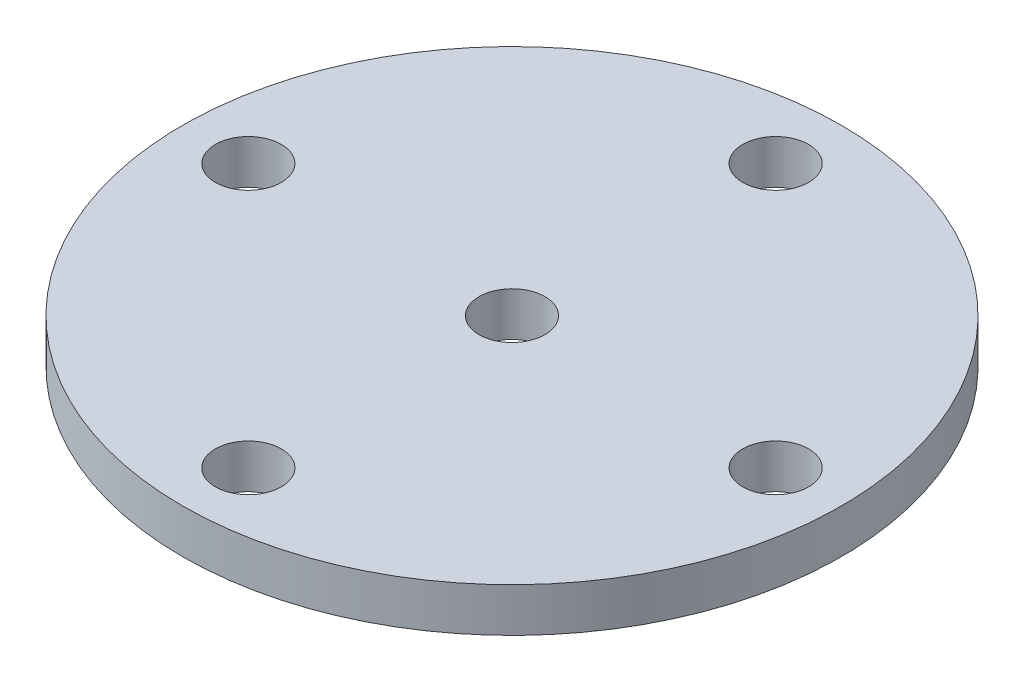
ISO-10303-21;
HEADER;
FILE_DESCRIPTION(('STEP AP214'),'2;1');
FILE_NAME('part.step','',(''),(''),'','','');
FILE_SCHEMA(('AUTOMOTIVE_DESIGN { 1 0 10303 214 1 1 1 1 }'));
ENDSEC;
DATA;
#1=APPLICATION_CONTEXT('core data for automotive mechanical design processes');
#2=APPLICATION_PROTOCOL_DEFINITION('international standard','automotive_design',2000,#1);
#3=PRODUCT_CONTEXT('',#1,'mechanical');
#4=PRODUCT('Part','Part','',(#3));
#5=PRODUCT_RELATED_PRODUCT_CATEGORY('part','',(#4));
#6=PRODUCT_DEFINITION_FORMATION('','',#4);
#7=PRODUCT_DEFINITION_CONTEXT('part definition',#1,'design');
#8=PRODUCT_DEFINITION('design','',#6,#7);
#9=PRODUCT_DEFINITION_SHAPE('','',#8);
#10=(LENGTH_UNIT() NAMED_UNIT(*) SI_UNIT(.MILLI.,.METRE.));
#11=(NAMED_UNIT(*) PLANE_ANGLE_UNIT() SI_UNIT($,.RADIAN.));
#12=(NAMED_UNIT(*) SI_UNIT($,.STERADIAN.) SOLID_ANGLE_UNIT());
#13=UNCERTAINTY_MEASURE_WITH_UNIT(LENGTH_MEASURE(1.E-05),#10,'distance_accuracy_value','');
#14=(GEOMETRIC_REPRESENTATION_CONTEXT(3) GLOBAL_UNCERTAINTY_ASSIGNED_CONTEXT((#13)) GLOBAL_UNIT_ASSIGNED_CONTEXT((#10,
#11,#12)) REPRESENTATION_CONTEXT('',''));
#15=CARTESIAN_POINT('',(0.,0.,0.));
#16=DIRECTION('',(0.,0.,1.));
#17=DIRECTION('',(1.,0.,0.));
#18=AXIS2_PLACEMENT_3D('',#15,#16,#17);
#19=CARTESIAN_POINT('',(0.,2.,0.));
#20=DIRECTION('',(0.,1.,0.));
#21=DIRECTION('',(0.,0.,1.));
#22=AXIS2_PLACEMENT_3D('',#19,#20,#21);
#23=PLANE('',#22);
#24=CARTESIAN_POINT('',(0.,2.,-12.));
#25=DIRECTION('',(0.,1.,0.));
#26=DIRECTION('',(0.,0.,1.));
#27=AXIS2_PLACEMENT_3D('',#24,#25,#26);
#28=CIRCLE('',#27,1.5);
#29=CARTESIAN_POINT('',(0.,2.,-10.5));
#30=VERTEX_POINT('',#29);
#31=EDGE_CURVE('E72',#30,#30,#28,.T.);
#32=ORIENTED_EDGE('',*,*,#31,.F.);
#33=EDGE_LOOP('',(#32));
#34=FACE_BOUND('',#33,.T.);
#35=CARTESIAN_POINT('',(-12.,2.,0.));
#36=DIRECTION('',(0.,1.,0.));
#37=DIRECTION('',(0.,0.,1.));
#38=AXIS2_PLACEMENT_3D('',#35,#36,#37);
#39=CIRCLE('',#38,1.5);
#40=CARTESIAN_POINT('',(-12.,2.,1.5));
#41=VERTEX_POINT('',#40);
#42=EDGE_CURVE('E56',#41,#41,#39,.T.);
#43=ORIENTED_EDGE('',*,*,#42,.F.);
#44=EDGE_LOOP('',(#43));
#45=FACE_BOUND('',#44,.T.);
#46=CARTESIAN_POINT('',(0.,2.,0.));
#47=DIRECTION('',(0.,1.,0.));
#48=DIRECTION('',(0.,0.,1.));
#49=AXIS2_PLACEMENT_3D('',#46,#47,#48);
#50=CIRCLE('',#49,15.);
#51=CARTESIAN_POINT('',(0.,2.,15.));
#52=VERTEX_POINT('',#51);
#53=EDGE_CURVE('E10',#52,#52,#50,.T.);
#54=ORIENTED_EDGE('',*,*,#53,.T.);
#55=EDGE_LOOP('',(#54));
#56=FACE_BOUND('',#55,.T.);
#57=CARTESIAN_POINT('',(0.,2.,0.));
#58=DIRECTION('',(0.,1.,0.));
#59=DIRECTION('',(0.,0.,1.));
#60=AXIS2_PLACEMENT_3D('',#57,#58,#59);
#61=CIRCLE('',#60,1.5);
#62=CARTESIAN_POINT('',(0.,2.,1.5));
#63=VERTEX_POINT('',#62);
#64=EDGE_CURVE('E50',#63,#63,#61,.T.);
#65=ORIENTED_EDGE('',*,*,#64,.F.);
#66=EDGE_LOOP('',(#65));
#67=FACE_BOUND('',#66,.T.);
#68=CARTESIAN_POINT('',(12.,2.,0.));
#69=DIRECTION('',(0.,1.,0.));
#70=DIRECTION('',(0.,0.,-1.));
#71=AXIS2_PLACEMENT_3D('',#68,#69,#70);
#72=CIRCLE('',#71,1.5);
#73=CARTESIAN_POINT('',(12.,2.,-1.5));
#74=VERTEX_POINT('',#73);
#75=EDGE_CURVE('E64',#74,#74,#72,.T.);
#76=ORIENTED_EDGE('',*,*,#75,.F.);
#77=EDGE_LOOP('',(#76));
#78=FACE_BOUND('',#77,.T.);
#79=CARTESIAN_POINT('',(0.,2.,12.));
#80=DIRECTION('',(0.,1.,0.));
#81=DIRECTION('',(0.,0.,-1.));
#82=AXIS2_PLACEMENT_3D('',#79,#80,#81);
#83=CIRCLE('',#82,1.5);
#84=CARTESIAN_POINT('',(0.,2.,10.5));
#85=VERTEX_POINT('',#84);
#86=EDGE_CURVE('E80',#85,#85,#83,.T.);
#87=ORIENTED_EDGE('',*,*,#86,.F.);
#88=EDGE_LOOP('',(#87));
#89=FACE_BOUND('',#88,.T.);
#90=ADVANCED_FACE('F37',(#34,#45,#56,#67,#78,#89),#23,.T.);
#91=CARTESIAN_POINT('',(0.,0.,0.));
#92=DIRECTION('',(0.,1.,0.));
#93=DIRECTION('',(0.,0.,1.));
#94=AXIS2_PLACEMENT_3D('',#91,#92,#93);
#95=PLANE('',#94);
#96=CARTESIAN_POINT('',(0.,0.,0.));
#97=DIRECTION('',(0.,1.,0.));
#98=DIRECTION('',(0.,0.,1.));
#99=AXIS2_PLACEMENT_3D('',#96,#97,#98);
#100=CIRCLE('',#99,15.);
#101=CARTESIAN_POINT('',(0.,0.,15.));
#102=VERTEX_POINT('',#101);
#103=EDGE_CURVE('E41',#102,#102,#100,.T.);
#104=ORIENTED_EDGE('',*,*,#103,.F.);
#105=EDGE_LOOP('',(#104));
#106=FACE_BOUND('',#105,.T.);
#107=CARTESIAN_POINT('',(0.,0.,0.));
#108=DIRECTION('',(0.,1.,0.));
#109=DIRECTION('',(0.,0.,1.));
#110=AXIS2_PLACEMENT_3D('',#107,#108,#109);
#111=CIRCLE('',#110,1.5);
#112=CARTESIAN_POINT('',(0.,0.,1.5));
#113=VERTEX_POINT('',#112);
#114=EDGE_CURVE('E52',#113,#113,#111,.T.);
#115=ORIENTED_EDGE('',*,*,#114,.T.);
#116=EDGE_LOOP('',(#115));
#117=FACE_BOUND('',#116,.T.);
#118=CARTESIAN_POINT('',(-12.,0.,0.));
#119=DIRECTION('',(0.,1.,0.));
#120=DIRECTION('',(0.,0.,1.));
#121=AXIS2_PLACEMENT_3D('',#118,#119,#120);
#122=CIRCLE('',#121,1.5);
#123=CARTESIAN_POINT('',(-12.,0.,1.5));
#124=VERTEX_POINT('',#123);
#125=EDGE_CURVE('E60',#124,#124,#122,.T.);
#126=ORIENTED_EDGE('',*,*,#125,.T.);
#127=EDGE_LOOP('',(#126));
#128=FACE_BOUND('',#127,.T.);
#129=CARTESIAN_POINT('',(12.,0.,0.));
#130=DIRECTION('',(0.,1.,0.));
#131=DIRECTION('',(0.,0.,-1.));
#132=AXIS2_PLACEMENT_3D('',#129,#130,#131);
#133=CIRCLE('',#132,1.5);
#134=CARTESIAN_POINT('',(12.,0.,-1.5));
#135=VERTEX_POINT('',#134);
#136=EDGE_CURVE('E68',#135,#135,#133,.T.);
#137=ORIENTED_EDGE('',*,*,#136,.T.);
#138=EDGE_LOOP('',(#137));
#139=FACE_BOUND('',#138,.T.);
#140=CARTESIAN_POINT('',(0.,0.,-12.));
#141=DIRECTION('',(0.,1.,0.));
#142=DIRECTION('',(0.,0.,1.));
#143=AXIS2_PLACEMENT_3D('',#140,#141,#142);
#144=CIRCLE('',#143,1.5);
#145=CARTESIAN_POINT('',(0.,0.,-10.5));
#146=VERTEX_POINT('',#145);
#147=EDGE_CURVE('E76',#146,#146,#144,.T.);
#148=ORIENTED_EDGE('',*,*,#147,.T.);
#149=EDGE_LOOP('',(#148));
#150=FACE_BOUND('',#149,.T.);
#151=CARTESIAN_POINT('',(0.,0.,12.));
#152=DIRECTION('',(0.,1.,0.));
#153=DIRECTION('',(0.,0.,-1.));
#154=AXIS2_PLACEMENT_3D('',#151,#152,#153);
#155=CIRCLE('',#154,1.5);
#156=CARTESIAN_POINT('',(0.,0.,10.5));
#157=VERTEX_POINT('',#156);
#158=EDGE_CURVE('E84',#157,#157,#155,.T.);
#159=ORIENTED_EDGE('',*,*,#158,.T.);
#160=EDGE_LOOP('',(#159));
#161=FACE_BOUND('',#160,.T.);
#162=ADVANCED_FACE('F96',(#106,#117,#128,#139,#150,#161),#95,.F.);
#163=CARTESIAN_POINT('',(0.,2.,0.));
#164=DIRECTION('',(0.,-1.,0.));
#165=DIRECTION('',(0.,0.,-1.));
#166=AXIS2_PLACEMENT_3D('',#163,#164,#165);
#167=CYLINDRICAL_SURFACE('',#166,15.);
#168=ORIENTED_EDGE('',*,*,#53,.F.);
#169=EDGE_LOOP('',(#168));
#170=FACE_BOUND('',#169,.T.);
#171=ORIENTED_EDGE('',*,*,#103,.T.);
#172=EDGE_LOOP('',(#171));
#173=FACE_BOUND('',#172,.T.);
#174=ADVANCED_FACE('F39',(#170,#173),#167,.T.);
#175=CARTESIAN_POINT('',(0.,2.,0.));
#176=DIRECTION('',(0.,-1.,0.));
#177=DIRECTION('',(0.,0.,-1.));
#178=AXIS2_PLACEMENT_3D('',#175,#176,#177);
#179=CYLINDRICAL_SURFACE('',#178,1.5);
#180=ORIENTED_EDGE('',*,*,#64,.T.);
#181=EDGE_LOOP('',(#180));
#182=FACE_BOUND('',#181,.T.);
#183=ORIENTED_EDGE('',*,*,#114,.F.);
#184=EDGE_LOOP('',(#183));
#185=FACE_BOUND('',#184,.T.);
#186=ADVANCED_FACE('F106',(#182,#185),#179,.F.);
#187=CARTESIAN_POINT('',(-12.,2.,0.));
#188=DIRECTION('',(0.,-1.,0.));
#189=DIRECTION('',(0.,0.,-1.));
#190=AXIS2_PLACEMENT_3D('',#187,#188,#189);
#191=CYLINDRICAL_SURFACE('',#190,1.5);
#192=ORIENTED_EDGE('',*,*,#42,.T.);
#193=EDGE_LOOP('',(#192));
#194=FACE_BOUND('',#193,.T.);
#195=ORIENTED_EDGE('',*,*,#125,.F.);
#196=EDGE_LOOP('',(#195));
#197=FACE_BOUND('',#196,.T.);
#198=ADVANCED_FACE('F109',(#194,#197),#191,.F.);
#199=CARTESIAN_POINT('',(12.,2.,0.));
#200=DIRECTION('',(0.,-1.,0.));
#201=DIRECTION('',(0.,0.,-1.));
#202=AXIS2_PLACEMENT_3D('',#199,#200,#201);
#203=CYLINDRICAL_SURFACE('',#202,1.5);
#204=ORIENTED_EDGE('',*,*,#75,.T.);
#205=EDGE_LOOP('',(#204));
#206=FACE_BOUND('',#205,.T.);
#207=ORIENTED_EDGE('',*,*,#136,.F.);
#208=EDGE_LOOP('',(#207));
#209=FACE_BOUND('',#208,.T.);
#210=ADVANCED_FACE('F113',(#206,#209),#203,.F.);
#211=CARTESIAN_POINT('',(0.,2.,-12.));
#212=DIRECTION('',(0.,-1.,0.));
#213=DIRECTION('',(0.,0.,-1.));
#214=AXIS2_PLACEMENT_3D('',#211,#212,#213);
#215=CYLINDRICAL_SURFACE('',#214,1.5);
#216=ORIENTED_EDGE('',*,*,#31,.T.);
#217=EDGE_LOOP('',(#216));
#218=FACE_BOUND('',#217,.T.);
#219=ORIENTED_EDGE('',*,*,#147,.F.);
#220=EDGE_LOOP('',(#219));
#221=FACE_BOUND('',#220,.T.);
#222=ADVANCED_FACE('F117',(#218,#221),#215,.F.);
#223=CARTESIAN_POINT('',(0.,2.,12.));
#224=DIRECTION('',(0.,-1.,0.));
#225=DIRECTION('',(0.,0.,-1.));
#226=AXIS2_PLACEMENT_3D('',#223,#224,#225);
#227=CYLINDRICAL_SURFACE('',#226,1.5);
#228=ORIENTED_EDGE('',*,*,#86,.T.);
#229=EDGE_LOOP('',(#228));
#230=FACE_BOUND('',#229,.T.);
#231=ORIENTED_EDGE('',*,*,#158,.F.);
#232=EDGE_LOOP('',(#231));
#233=FACE_BOUND('',#232,.T.);
#234=ADVANCED_FACE('F92',(#230,#233),#227,.F.);
#235=CLOSED_SHELL('',(#90,#162,#174,#186,#198,#210,#222,#234));
#236=MANIFOLD_SOLID_BREP('B2',#235);
#237=ADVANCED_BREP_SHAPE_REPRESENTATION('',(#18,#236),#14);
#238=SHAPE_DEFINITION_REPRESENTATION(#9,#237);
ENDSEC;
END-ISO-10303-21;
